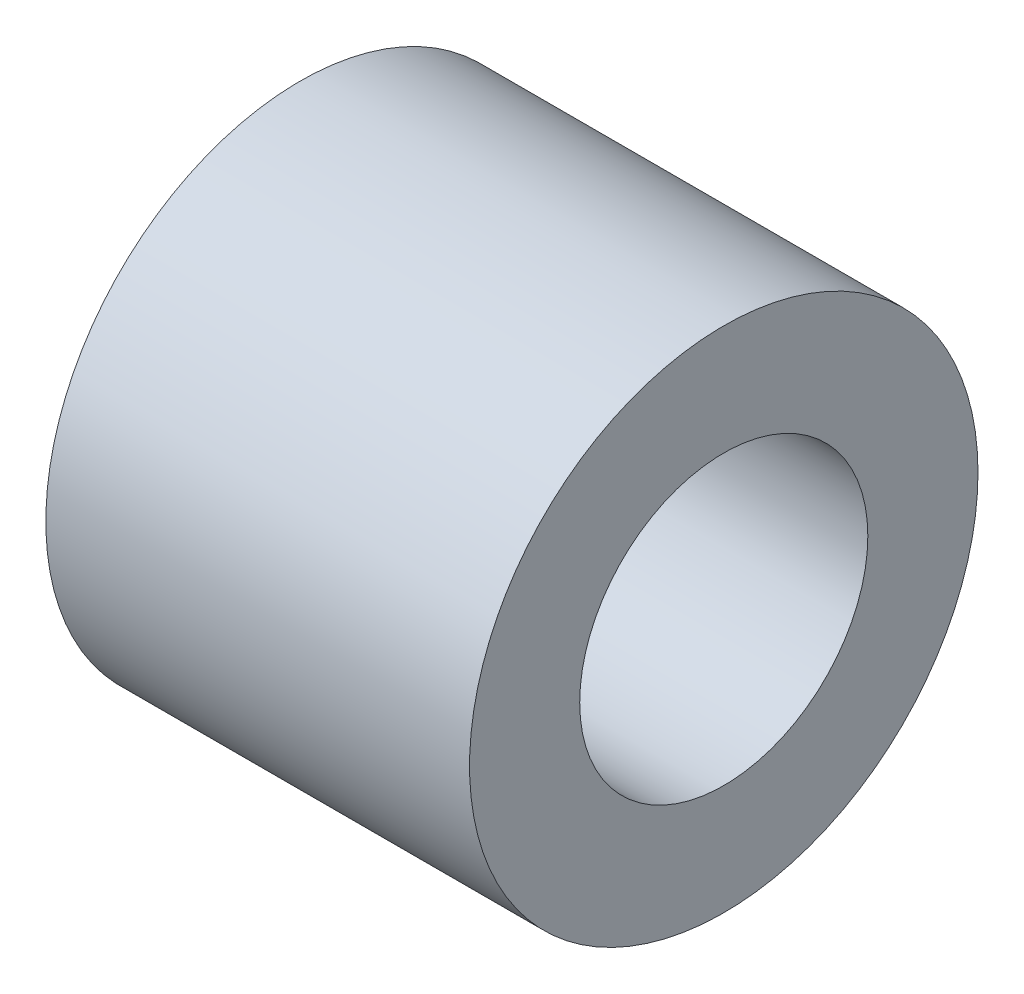
ISO-10303-21;
HEADER;
FILE_DESCRIPTION(('STEP AP214'),'2;1');
FILE_NAME('part.step','',(''),(''),'','','');
FILE_SCHEMA(('AUTOMOTIVE_DESIGN { 1 0 10303 214 1 1 1 1 }'));
ENDSEC;
DATA;
#1=APPLICATION_CONTEXT('core data for automotive mechanical design processes');
#2=APPLICATION_PROTOCOL_DEFINITION('international standard','automotive_design',2000,#1);
#3=PRODUCT_CONTEXT('',#1,'mechanical');
#4=PRODUCT('Part','Part','',(#3));
#5=PRODUCT_RELATED_PRODUCT_CATEGORY('part','',(#4));
#6=PRODUCT_DEFINITION_FORMATION('','',#4);
#7=PRODUCT_DEFINITION_CONTEXT('part definition',#1,'design');
#8=PRODUCT_DEFINITION('design','',#6,#7);
#9=PRODUCT_DEFINITION_SHAPE('','',#8);
#10=(LENGTH_UNIT() NAMED_UNIT(*) SI_UNIT(.MILLI.,.METRE.));
#11=(NAMED_UNIT(*) PLANE_ANGLE_UNIT() SI_UNIT($,.RADIAN.));
#12=(NAMED_UNIT(*) SI_UNIT($,.STERADIAN.) SOLID_ANGLE_UNIT());
#13=UNCERTAINTY_MEASURE_WITH_UNIT(LENGTH_MEASURE(1.E-05),#10,'distance_accuracy_value','');
#14=(GEOMETRIC_REPRESENTATION_CONTEXT(3) GLOBAL_UNCERTAINTY_ASSIGNED_CONTEXT((#13)) GLOBAL_UNIT_ASSIGNED_CONTEXT((#10,
#11,#12)) REPRESENTATION_CONTEXT('',''));
#15=CARTESIAN_POINT('',(0.,0.,0.));
#16=DIRECTION('',(0.,0.,1.));
#17=DIRECTION('',(1.,0.,0.));
#18=AXIS2_PLACEMENT_3D('',#15,#16,#17);
#19=CARTESIAN_POINT('',(48.9,-18.5,217.));
#20=DIRECTION('',(1.,0.,0.));
#21=DIRECTION('',(0.,0.,-1.));
#22=AXIS2_PLACEMENT_3D('',#19,#20,#21);
#23=CYLINDRICAL_SURFACE('',#22,1.7);
#24=DIRECTION('',(1.,0.,0.));
#25=VECTOR('',#24,1.);
#26=CARTESIAN_POINT('',(48.9,-18.5,215.3));
#27=LINE('',#26,#25);
#28=CARTESIAN_POINT('',(49.,-18.5,215.3));
#29=VERTEX_POINT('',#28);
#30=CARTESIAN_POINT('',(54.,-18.5,215.3));
#31=VERTEX_POINT('',#30);
#32=EDGE_CURVE('E10',#29,#31,#27,.T.);
#33=ORIENTED_EDGE('',*,*,#32,.F.);
#34=CARTESIAN_POINT('',(49.,-18.5,217.));
#35=DIRECTION('',(1.,0.,0.));
#36=DIRECTION('',(0.,0.,-1.));
#37=AXIS2_PLACEMENT_3D('',#34,#35,#36);
#38=CIRCLE('',#37,1.7);
#39=EDGE_CURVE('E26',#29,#29,#38,.T.);
#40=ORIENTED_EDGE('',*,*,#39,.F.);
#41=ORIENTED_EDGE('',*,*,#32,.T.);
#42=CARTESIAN_POINT('',(54.,-18.5,217.));
#43=DIRECTION('',(1.,0.,0.));
#44=DIRECTION('',(0.,0.,-1.));
#45=AXIS2_PLACEMENT_3D('',#42,#43,#44);
#46=CIRCLE('',#45,1.7);
#47=EDGE_CURVE('E63',#31,#31,#46,.T.);
#48=ORIENTED_EDGE('',*,*,#47,.T.);
#49=EDGE_LOOP('',(#33,#40,#41,#48));
#50=FACE_BOUND('',#49,.T.);
#51=ADVANCED_FACE('F15',(#50),#23,.F.);
#52=CARTESIAN_POINT('',(49.,-18.5,217.));
#53=DIRECTION('',(1.,0.,0.));
#54=DIRECTION('',(0.,0.,1.));
#55=AXIS2_PLACEMENT_3D('',#52,#53,#54);
#56=PLANE('',#55);
#57=ORIENTED_EDGE('',*,*,#39,.T.);
#58=EDGE_LOOP('',(#57));
#59=FACE_BOUND('',#58,.T.);
#60=CARTESIAN_POINT('',(49.,-18.5,217.));
#61=DIRECTION('',(1.,0.,0.));
#62=DIRECTION('',(0.,0.,-1.));
#63=AXIS2_PLACEMENT_3D('',#60,#61,#62);
#64=CIRCLE('',#63,3.);
#65=CARTESIAN_POINT('',(49.,-18.5,214.));
#66=VERTEX_POINT('',#65);
#67=EDGE_CURVE('E50',#66,#66,#64,.T.);
#68=ORIENTED_EDGE('',*,*,#67,.F.);
#69=EDGE_LOOP('',(#68));
#70=FACE_BOUND('',#69,.T.);
#71=ADVANCED_FACE('F70',(#59,#70),#56,.F.);
#72=CARTESIAN_POINT('',(54.,-18.5,217.));
#73=DIRECTION('',(1.,0.,0.));
#74=DIRECTION('',(0.,0.,1.));
#75=AXIS2_PLACEMENT_3D('',#72,#73,#74);
#76=PLANE('',#75);
#77=ORIENTED_EDGE('',*,*,#47,.F.);
#78=EDGE_LOOP('',(#77));
#79=FACE_BOUND('',#78,.T.);
#80=CARTESIAN_POINT('',(54.,-18.5,217.));
#81=DIRECTION('',(1.,0.,0.));
#82=DIRECTION('',(0.,0.,-1.));
#83=AXIS2_PLACEMENT_3D('',#80,#81,#82);
#84=CIRCLE('',#83,3.);
#85=CARTESIAN_POINT('',(54.,-18.5,214.));
#86=VERTEX_POINT('',#85);
#87=EDGE_CURVE('E55',#86,#86,#84,.T.);
#88=ORIENTED_EDGE('',*,*,#87,.T.);
#89=EDGE_LOOP('',(#88));
#90=FACE_BOUND('',#89,.T.);
#91=ADVANCED_FACE('F58',(#79,#90),#76,.T.);
#92=CARTESIAN_POINT('',(49.,-18.5,217.));
#93=DIRECTION('',(1.,0.,0.));
#94=DIRECTION('',(0.,0.,-1.));
#95=AXIS2_PLACEMENT_3D('',#92,#93,#94);
#96=CYLINDRICAL_SURFACE('',#95,3.);
#97=ORIENTED_EDGE('',*,*,#87,.F.);
#98=DIRECTION('',(1.,0.,0.));
#99=VECTOR('',#98,1.);
#100=CARTESIAN_POINT('',(49.,-18.5,214.));
#101=LINE('',#100,#99);
#102=EDGE_CURVE('E19',#66,#86,#101,.T.);
#103=ORIENTED_EDGE('',*,*,#102,.F.);
#104=ORIENTED_EDGE('',*,*,#67,.T.);
#105=ORIENTED_EDGE('',*,*,#102,.T.);
#106=EDGE_LOOP('',(#97,#103,#104,#105));
#107=FACE_BOUND('',#106,.T.);
#108=ADVANCED_FACE('F17',(#107),#96,.T.);
#109=CLOSED_SHELL('',(#51,#71,#91,#108));
#110=MANIFOLD_SOLID_BREP('B1',#109);
#111=ADVANCED_BREP_SHAPE_REPRESENTATION('',(#18,#110),#14);
#112=SHAPE_DEFINITION_REPRESENTATION(#9,#111);
ENDSEC;
END-ISO-10303-21;
